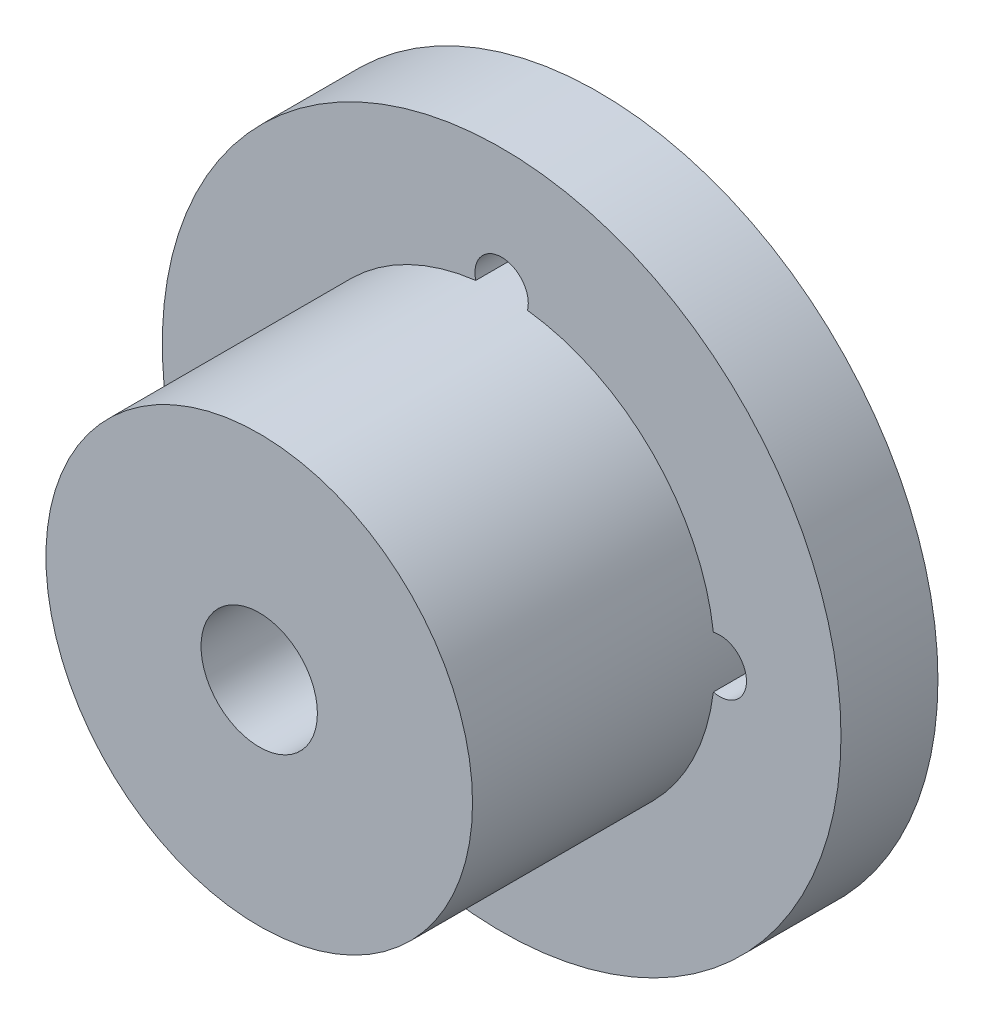
ISO-10303-21;
HEADER;
FILE_DESCRIPTION(('STEP AP214'),'2;1');
FILE_NAME('part.step','',(''),(''),'','','');
FILE_SCHEMA(('AUTOMOTIVE_DESIGN { 1 0 10303 214 1 1 1 1 }'));
ENDSEC;
DATA;
#1=APPLICATION_CONTEXT('core data for automotive mechanical design processes');
#2=APPLICATION_PROTOCOL_DEFINITION('international standard','automotive_design',2000,#1);
#3=PRODUCT_CONTEXT('',#1,'mechanical');
#4=PRODUCT('Part','Part','',(#3));
#5=PRODUCT_RELATED_PRODUCT_CATEGORY('part','',(#4));
#6=PRODUCT_DEFINITION_FORMATION('','',#4);
#7=PRODUCT_DEFINITION_CONTEXT('part definition',#1,'design');
#8=PRODUCT_DEFINITION('design','',#6,#7);
#9=PRODUCT_DEFINITION_SHAPE('','',#8);
#10=(LENGTH_UNIT() NAMED_UNIT(*) SI_UNIT(.MILLI.,.METRE.));
#11=(NAMED_UNIT(*) PLANE_ANGLE_UNIT() SI_UNIT($,.RADIAN.));
#12=(NAMED_UNIT(*) SI_UNIT($,.STERADIAN.) SOLID_ANGLE_UNIT());
#13=UNCERTAINTY_MEASURE_WITH_UNIT(LENGTH_MEASURE(1.E-05),#10,'distance_accuracy_value','');
#14=(GEOMETRIC_REPRESENTATION_CONTEXT(3) GLOBAL_UNCERTAINTY_ASSIGNED_CONTEXT((#13)) GLOBAL_UNIT_ASSIGNED_CONTEXT((#10,
#11,#12)) REPRESENTATION_CONTEXT('',''));
#15=CARTESIAN_POINT('',(0.,0.,0.));
#16=DIRECTION('',(0.,0.,1.));
#17=DIRECTION('',(1.,0.,0.));
#18=AXIS2_PLACEMENT_3D('',#15,#16,#17);
#19=CARTESIAN_POINT('',(0.,0.,10.));
#20=DIRECTION('',(0.,0.,1.));
#21=DIRECTION('',(1.,0.,0.));
#22=AXIS2_PLACEMENT_3D('',#19,#20,#21);
#23=PLANE('',#22);
#24=CARTESIAN_POINT('',(0.,0.,10.));
#25=DIRECTION('',(0.,0.,1.));
#26=DIRECTION('',(1.,0.,0.));
#27=AXIS2_PLACEMENT_3D('',#24,#25,#26);
#28=CIRCLE('',#27,35.);
#29=CARTESIAN_POINT('',(35.,0.,10.));
#30=VERTEX_POINT('',#29);
#31=EDGE_CURVE('E127',#30,#30,#28,.T.);
#32=ORIENTED_EDGE('',*,*,#31,.T.);
#33=EDGE_LOOP('',(#32));
#34=FACE_BOUND('',#33,.T.);
#35=CARTESIAN_POINT('',(22.5,0.,10.));
#36=DIRECTION('',(0.,0.,1.));
#37=DIRECTION('',(1.,0.,0.));
#38=AXIS2_PLACEMENT_3D('',#35,#36,#37);
#39=CIRCLE('',#38,2.75);
#40=CARTESIAN_POINT('',(21.8375,-2.6690061352496,10.));
#41=VERTEX_POINT('',#40);
#42=CARTESIAN_POINT('',(21.8375,2.6690061352496,10.));
#43=VERTEX_POINT('',#42);
#44=EDGE_CURVE('E112',#41,#43,#39,.T.);
#45=ORIENTED_EDGE('',*,*,#44,.F.);
#46=CARTESIAN_POINT('',(0.,0.,10.));
#47=DIRECTION('',(0.,0.,1.));
#48=DIRECTION('',(1.,0.,0.));
#49=AXIS2_PLACEMENT_3D('',#46,#47,#48);
#50=CIRCLE('',#49,22.);
#51=CARTESIAN_POINT('',(2.66900613524959,-21.8375,10.));
#52=VERTEX_POINT('',#51);
#53=EDGE_CURVE('E170',#41,#52,#50,.F.);
#54=ORIENTED_EDGE('',*,*,#53,.T.);
#55=CARTESIAN_POINT('',(0.,-22.5,10.));
#56=DIRECTION('',(0.,0.,1.));
#57=DIRECTION('',(1.,0.,0.));
#58=AXIS2_PLACEMENT_3D('',#55,#56,#57);
#59=CIRCLE('',#58,2.75);
#60=CARTESIAN_POINT('',(-2.66900613524959,-21.8375,10.));
#61=VERTEX_POINT('',#60);
#62=EDGE_CURVE('E140',#61,#52,#59,.T.);
#63=ORIENTED_EDGE('',*,*,#62,.F.);
#64=CARTESIAN_POINT('',(-21.8375,-2.6690061352496,10.));
#65=VERTEX_POINT('',#64);
#66=EDGE_CURVE('E48',#61,#65,#50,.F.);
#67=ORIENTED_EDGE('',*,*,#66,.T.);
#68=CARTESIAN_POINT('',(-22.5,0.,10.));
#69=DIRECTION('',(0.,0.,1.));
#70=DIRECTION('',(1.,0.,0.));
#71=AXIS2_PLACEMENT_3D('',#68,#69,#70);
#72=CIRCLE('',#71,2.75);
#73=CARTESIAN_POINT('',(-21.8375,2.6690061352496,10.));
#74=VERTEX_POINT('',#73);
#75=EDGE_CURVE('E149',#74,#65,#72,.T.);
#76=ORIENTED_EDGE('',*,*,#75,.F.);
#77=CARTESIAN_POINT('',(-2.6690061352496,21.8375,10.));
#78=VERTEX_POINT('',#77);
#79=EDGE_CURVE('E165',#74,#78,#50,.F.);
#80=ORIENTED_EDGE('',*,*,#79,.T.);
#81=CARTESIAN_POINT('',(0.,22.5,10.));
#82=DIRECTION('',(0.,0.,1.));
#83=DIRECTION('',(1.,0.,0.));
#84=AXIS2_PLACEMENT_3D('',#81,#82,#83);
#85=CIRCLE('',#84,2.75);
#86=CARTESIAN_POINT('',(2.6690061352496,21.8375,10.));
#87=VERTEX_POINT('',#86);
#88=EDGE_CURVE('E118',#87,#78,#85,.T.);
#89=ORIENTED_EDGE('',*,*,#88,.F.);
#90=EDGE_CURVE('E114',#87,#43,#50,.F.);
#91=ORIENTED_EDGE('',*,*,#90,.T.);
#92=EDGE_LOOP('',(#45,#54,#63,#67,#76,#80,#89,#91));
#93=FACE_BOUND('',#92,.T.);
#94=ADVANCED_FACE('F33',(#34,#93),#23,.T.);
#95=CARTESIAN_POINT('',(22.5,0.,10.));
#96=DIRECTION('',(0.,0.,-1.));
#97=DIRECTION('',(-1.,0.,0.));
#98=AXIS2_PLACEMENT_3D('',#95,#96,#97);
#99=CYLINDRICAL_SURFACE('',#98,2.75);
#100=ORIENTED_EDGE('',*,*,#44,.T.);
#101=DIRECTION('',(0.,0.,-1.));
#102=VECTOR('',#101,1.);
#103=CARTESIAN_POINT('',(21.8375,2.6690061352496,17.5));
#104=LINE('',#103,#102);
#105=CARTESIAN_POINT('',(21.8375,2.6690061352496,0.));
#106=VERTEX_POINT('',#105);
#107=EDGE_CURVE('E55',#43,#106,#104,.T.);
#108=ORIENTED_EDGE('',*,*,#107,.T.);
#109=CARTESIAN_POINT('',(22.5,0.,0.));
#110=DIRECTION('',(0.,0.,1.));
#111=DIRECTION('',(1.,0.,0.));
#112=AXIS2_PLACEMENT_3D('',#109,#110,#111);
#113=CIRCLE('',#112,2.75);
#114=CARTESIAN_POINT('',(21.8375,-2.6690061352496,0.));
#115=VERTEX_POINT('',#114);
#116=EDGE_CURVE('E110',#115,#106,#113,.T.);
#117=ORIENTED_EDGE('',*,*,#116,.F.);
#118=DIRECTION('',(0.,0.,-1.));
#119=VECTOR('',#118,1.);
#120=CARTESIAN_POINT('',(21.8375,-2.6690061352496,17.5));
#121=LINE('',#120,#119);
#122=EDGE_CURVE('E99',#115,#41,#121,.F.);
#123=ORIENTED_EDGE('',*,*,#122,.T.);
#124=EDGE_LOOP('',(#100,#108,#117,#123));
#125=FACE_BOUND('',#124,.T.);
#126=ADVANCED_FACE('F109',(#125),#99,.F.);
#127=CARTESIAN_POINT('',(0.,22.5,10.));
#128=DIRECTION('',(0.,0.,-1.));
#129=DIRECTION('',(-1.,0.,0.));
#130=AXIS2_PLACEMENT_3D('',#127,#128,#129);
#131=CYLINDRICAL_SURFACE('',#130,2.75);
#132=ORIENTED_EDGE('',*,*,#88,.T.);
#133=DIRECTION('',(0.,0.,-1.));
#134=VECTOR('',#133,1.);
#135=CARTESIAN_POINT('',(-2.6690061352496,21.8375,17.5));
#136=LINE('',#135,#134);
#137=CARTESIAN_POINT('',(-2.6690061352496,21.8375,0.));
#138=VERTEX_POINT('',#137);
#139=EDGE_CURVE('E163',#78,#138,#136,.T.);
#140=ORIENTED_EDGE('',*,*,#139,.T.);
#141=CARTESIAN_POINT('',(0.,22.5,0.));
#142=DIRECTION('',(0.,0.,1.));
#143=DIRECTION('',(1.,0.,0.));
#144=AXIS2_PLACEMENT_3D('',#141,#142,#143);
#145=CIRCLE('',#144,2.75);
#146=CARTESIAN_POINT('',(2.6690061352496,21.8375,0.));
#147=VERTEX_POINT('',#146);
#148=EDGE_CURVE('E123',#147,#138,#145,.T.);
#149=ORIENTED_EDGE('',*,*,#148,.F.);
#150=DIRECTION('',(0.,0.,-1.));
#151=VECTOR('',#150,1.);
#152=CARTESIAN_POINT('',(2.6690061352496,21.8375,17.5));
#153=LINE('',#152,#151);
#154=EDGE_CURVE('E161',#147,#87,#153,.F.);
#155=ORIENTED_EDGE('',*,*,#154,.T.);
#156=EDGE_LOOP('',(#132,#140,#149,#155));
#157=FACE_BOUND('',#156,.T.);
#158=ADVANCED_FACE('F160',(#157),#131,.F.);
#159=CARTESIAN_POINT('',(-22.5,0.,10.));
#160=DIRECTION('',(0.,0.,-1.));
#161=DIRECTION('',(-1.,0.,0.));
#162=AXIS2_PLACEMENT_3D('',#159,#160,#161);
#163=CYLINDRICAL_SURFACE('',#162,2.75);
#164=ORIENTED_EDGE('',*,*,#75,.T.);
#165=DIRECTION('',(0.,0.,-1.));
#166=VECTOR('',#165,1.);
#167=CARTESIAN_POINT('',(-21.8375,-2.6690061352496,17.5));
#168=LINE('',#167,#166);
#169=CARTESIAN_POINT('',(-21.8375,-2.6690061352496,0.));
#170=VERTEX_POINT('',#169);
#171=EDGE_CURVE('E175',#65,#170,#168,.T.);
#172=ORIENTED_EDGE('',*,*,#171,.T.);
#173=CARTESIAN_POINT('',(-22.5,0.,0.));
#174=DIRECTION('',(0.,0.,1.));
#175=DIRECTION('',(1.,0.,0.));
#176=AXIS2_PLACEMENT_3D('',#173,#174,#175);
#177=CIRCLE('',#176,2.75);
#178=CARTESIAN_POINT('',(-21.8375,2.6690061352496,0.));
#179=VERTEX_POINT('',#178);
#180=EDGE_CURVE('E146',#179,#170,#177,.T.);
#181=ORIENTED_EDGE('',*,*,#180,.F.);
#182=DIRECTION('',(0.,0.,-1.));
#183=VECTOR('',#182,1.);
#184=CARTESIAN_POINT('',(-21.8375,2.6690061352496,17.5));
#185=LINE('',#184,#183);
#186=EDGE_CURVE('E168',#179,#74,#185,.F.);
#187=ORIENTED_EDGE('',*,*,#186,.T.);
#188=EDGE_LOOP('',(#164,#172,#181,#187));
#189=FACE_BOUND('',#188,.T.);
#190=ADVANCED_FACE('F227',(#189),#163,.F.);
#191=CARTESIAN_POINT('',(0.,-22.5,10.));
#192=DIRECTION('',(0.,0.,-1.));
#193=DIRECTION('',(-1.,0.,0.));
#194=AXIS2_PLACEMENT_3D('',#191,#192,#193);
#195=CYLINDRICAL_SURFACE('',#194,2.75);
#196=ORIENTED_EDGE('',*,*,#62,.T.);
#197=DIRECTION('',(0.,0.,-1.));
#198=VECTOR('',#197,1.);
#199=CARTESIAN_POINT('',(2.66900613524959,-21.8375,17.5));
#200=LINE('',#199,#198);
#201=CARTESIAN_POINT('',(2.66900613524959,-21.8375,0.));
#202=VERTEX_POINT('',#201);
#203=EDGE_CURVE('E41',#52,#202,#200,.T.);
#204=ORIENTED_EDGE('',*,*,#203,.T.);
#205=CARTESIAN_POINT('',(0.,-22.5,0.));
#206=DIRECTION('',(0.,0.,1.));
#207=DIRECTION('',(1.,0.,0.));
#208=AXIS2_PLACEMENT_3D('',#205,#206,#207);
#209=CIRCLE('',#208,2.75);
#210=CARTESIAN_POINT('',(-2.66900613524959,-21.8375,0.));
#211=VERTEX_POINT('',#210);
#212=EDGE_CURVE('E113',#211,#202,#209,.T.);
#213=ORIENTED_EDGE('',*,*,#212,.F.);
#214=DIRECTION('',(0.,0.,-1.));
#215=VECTOR('',#214,1.);
#216=CARTESIAN_POINT('',(-2.66900613524959,-21.8375,17.5));
#217=LINE('',#216,#215);
#218=EDGE_CURVE('E130',#211,#61,#217,.F.);
#219=ORIENTED_EDGE('',*,*,#218,.T.);
#220=EDGE_LOOP('',(#196,#204,#213,#219));
#221=FACE_BOUND('',#220,.T.);
#222=ADVANCED_FACE('F138',(#221),#195,.F.);
#223=CARTESIAN_POINT('',(0.,0.,0.));
#224=DIRECTION('',(0.,0.,1.));
#225=DIRECTION('',(1.,0.,0.));
#226=AXIS2_PLACEMENT_3D('',#223,#224,#225);
#227=PLANE('',#226);
#228=ORIENTED_EDGE('',*,*,#212,.T.);
#229=CARTESIAN_POINT('',(0.,0.,0.));
#230=DIRECTION('',(0.,0.,1.));
#231=DIRECTION('',(1.,0.,0.));
#232=AXIS2_PLACEMENT_3D('',#229,#230,#231);
#233=CIRCLE('',#232,22.);
#234=EDGE_CURVE('E103',#211,#202,#233,.T.);
#235=ORIENTED_EDGE('',*,*,#234,.F.);
#236=EDGE_LOOP('',(#228,#235));
#237=FACE_BOUND('',#236,.T.);
#238=ORIENTED_EDGE('',*,*,#180,.T.);
#239=EDGE_CURVE('E313',#179,#170,#233,.T.);
#240=ORIENTED_EDGE('',*,*,#239,.F.);
#241=EDGE_LOOP('',(#238,#240));
#242=FACE_BOUND('',#241,.T.);
#243=ORIENTED_EDGE('',*,*,#148,.T.);
#244=EDGE_CURVE('E106',#147,#138,#233,.T.);
#245=ORIENTED_EDGE('',*,*,#244,.F.);
#246=EDGE_LOOP('',(#243,#245));
#247=FACE_BOUND('',#246,.T.);
#248=EDGE_CURVE('E95',#115,#106,#233,.T.);
#249=ORIENTED_EDGE('',*,*,#248,.F.);
#250=ORIENTED_EDGE('',*,*,#116,.T.);
#251=EDGE_LOOP('',(#249,#250));
#252=FACE_BOUND('',#251,.T.);
#253=CARTESIAN_POINT('',(0.,0.,0.));
#254=DIRECTION('',(0.,0.,1.));
#255=DIRECTION('',(1.,0.,0.));
#256=AXIS2_PLACEMENT_3D('',#253,#254,#255);
#257=CIRCLE('',#256,35.);
#258=CARTESIAN_POINT('',(35.,0.,0.));
#259=VERTEX_POINT('',#258);
#260=EDGE_CURVE('E120',#259,#259,#257,.T.);
#261=ORIENTED_EDGE('',*,*,#260,.F.);
#262=EDGE_LOOP('',(#261));
#263=FACE_BOUND('',#262,.T.);
#264=CARTESIAN_POINT('',(0.,0.,0.));
#265=DIRECTION('',(0.,0.,1.));
#266=DIRECTION('',(1.,0.,0.));
#267=AXIS2_PLACEMENT_3D('',#264,#265,#266);
#268=CIRCLE('',#267,4.);
#269=CARTESIAN_POINT('',(4.,0.,0.));
#270=VERTEX_POINT('',#269);
#271=EDGE_CURVE('E184',#270,#270,#268,.T.);
#272=ORIENTED_EDGE('',*,*,#271,.T.);
#273=EDGE_LOOP('',(#272));
#274=FACE_BOUND('',#273,.T.);
#275=ADVANCED_FACE('F116',(#237,#242,#247,#252,#263,#274),#227,.F.);
#276=CARTESIAN_POINT('',(0.,0.,10.));
#277=DIRECTION('',(0.,0.,-1.));
#278=DIRECTION('',(-1.,0.,0.));
#279=AXIS2_PLACEMENT_3D('',#276,#277,#278);
#280=CYLINDRICAL_SURFACE('',#279,35.);
#281=ORIENTED_EDGE('',*,*,#31,.F.);
#282=EDGE_LOOP('',(#281));
#283=FACE_BOUND('',#282,.T.);
#284=ORIENTED_EDGE('',*,*,#260,.T.);
#285=EDGE_LOOP('',(#284));
#286=FACE_BOUND('',#285,.T.);
#287=ADVANCED_FACE('F35',(#283,#286),#280,.T.);
#288=CARTESIAN_POINT('',(0.,0.,10.));
#289=DIRECTION('',(0.,0.,-1.));
#290=DIRECTION('',(-1.,0.,0.));
#291=AXIS2_PLACEMENT_3D('',#288,#289,#290);
#292=CYLINDRICAL_SURFACE('',#291,6.);
#293=CARTESIAN_POINT('',(0.,0.,20.));
#294=DIRECTION('',(0.,0.,1.));
#295=DIRECTION('',(1.,0.,0.));
#296=AXIS2_PLACEMENT_3D('',#293,#294,#295);
#297=CIRCLE('',#296,6.);
#298=CARTESIAN_POINT('',(6.,0.,20.));
#299=VERTEX_POINT('',#298);
#300=EDGE_CURVE('E11',#299,#299,#297,.T.);
#301=ORIENTED_EDGE('',*,*,#300,.F.);
#302=EDGE_LOOP('',(#301));
#303=FACE_BOUND('',#302,.T.);
#304=CARTESIAN_POINT('',(0.,0.,35.));
#305=DIRECTION('',(0.,0.,1.));
#306=DIRECTION('',(1.,0.,0.));
#307=AXIS2_PLACEMENT_3D('',#304,#305,#306);
#308=CIRCLE('',#307,6.);
#309=CARTESIAN_POINT('',(6.,0.,35.));
#310=VERTEX_POINT('',#309);
#311=EDGE_CURVE('E104',#310,#310,#308,.T.);
#312=ORIENTED_EDGE('',*,*,#311,.T.);
#313=EDGE_LOOP('',(#312));
#314=FACE_BOUND('',#313,.T.);
#315=ADVANCED_FACE('F199',(#303,#314),#292,.F.);
#316=CARTESIAN_POINT('',(0.,0.,35.));
#317=DIRECTION('',(0.,0.,1.));
#318=DIRECTION('',(1.,0.,0.));
#319=AXIS2_PLACEMENT_3D('',#316,#317,#318);
#320=PLANE('',#319);
#321=CARTESIAN_POINT('',(0.,0.,35.));
#322=DIRECTION('',(0.,0.,1.));
#323=DIRECTION('',(1.,0.,0.));
#324=AXIS2_PLACEMENT_3D('',#321,#322,#323);
#325=CIRCLE('',#324,22.);
#326=CARTESIAN_POINT('',(22.,0.,35.));
#327=VERTEX_POINT('',#326);
#328=EDGE_CURVE('E177',#327,#327,#325,.T.);
#329=ORIENTED_EDGE('',*,*,#328,.T.);
#330=EDGE_LOOP('',(#329));
#331=FACE_BOUND('',#330,.T.);
#332=ORIENTED_EDGE('',*,*,#311,.F.);
#333=EDGE_LOOP('',(#332));
#334=FACE_BOUND('',#333,.T.);
#335=ADVANCED_FACE('F202',(#331,#334),#320,.T.);
#336=CARTESIAN_POINT('',(0.,0.,35.));
#337=DIRECTION('',(0.,0.,-1.));
#338=DIRECTION('',(-1.,0.,0.));
#339=AXIS2_PLACEMENT_3D('',#336,#337,#338);
#340=CYLINDRICAL_SURFACE('',#339,22.);
#341=ORIENTED_EDGE('',*,*,#107,.F.);
#342=ORIENTED_EDGE('',*,*,#90,.F.);
#343=ORIENTED_EDGE('',*,*,#154,.F.);
#344=ORIENTED_EDGE('',*,*,#244,.T.);
#345=ORIENTED_EDGE('',*,*,#139,.F.);
#346=ORIENTED_EDGE('',*,*,#79,.F.);
#347=ORIENTED_EDGE('',*,*,#186,.F.);
#348=ORIENTED_EDGE('',*,*,#239,.T.);
#349=ORIENTED_EDGE('',*,*,#171,.F.);
#350=ORIENTED_EDGE('',*,*,#66,.F.);
#351=ORIENTED_EDGE('',*,*,#218,.F.);
#352=ORIENTED_EDGE('',*,*,#234,.T.);
#353=ORIENTED_EDGE('',*,*,#203,.F.);
#354=ORIENTED_EDGE('',*,*,#53,.F.);
#355=ORIENTED_EDGE('',*,*,#122,.F.);
#356=ORIENTED_EDGE('',*,*,#248,.T.);
#357=EDGE_LOOP('',(#341,#342,#343,#344,#345,#346,#347,#348,#349,#350,#351,#352,#353,#354,#355,#356));
#358=FACE_BOUND('',#357,.T.);
#359=ORIENTED_EDGE('',*,*,#328,.F.);
#360=EDGE_LOOP('',(#359));
#361=FACE_BOUND('',#360,.T.);
#362=ADVANCED_FACE('F96',(#358,#361),#340,.T.);
#363=CARTESIAN_POINT('',(0.,0.,20.));
#364=DIRECTION('',(0.,0.,1.));
#365=DIRECTION('',(1.,0.,0.));
#366=AXIS2_PLACEMENT_3D('',#363,#364,#365);
#367=PLANE('',#366);
#368=CARTESIAN_POINT('',(0.,0.,20.));
#369=DIRECTION('',(0.,0.,1.));
#370=DIRECTION('',(1.,0.,0.));
#371=AXIS2_PLACEMENT_3D('',#368,#369,#370);
#372=CIRCLE('',#371,4.);
#373=CARTESIAN_POINT('',(4.,0.,20.));
#374=VERTEX_POINT('',#373);
#375=EDGE_CURVE('E183',#374,#374,#372,.T.);
#376=ORIENTED_EDGE('',*,*,#375,.F.);
#377=EDGE_LOOP('',(#376));
#378=FACE_BOUND('',#377,.T.);
#379=ORIENTED_EDGE('',*,*,#300,.T.);
#380=EDGE_LOOP('',(#379));
#381=FACE_BOUND('',#380,.T.);
#382=ADVANCED_FACE('F193',(#378,#381),#367,.T.);
#383=CARTESIAN_POINT('',(0.,0.,20.));
#384=DIRECTION('',(0.,0.,-1.));
#385=DIRECTION('',(-1.,0.,0.));
#386=AXIS2_PLACEMENT_3D('',#383,#384,#385);
#387=CYLINDRICAL_SURFACE('',#386,4.);
#388=ORIENTED_EDGE('',*,*,#375,.T.);
#389=EDGE_LOOP('',(#388));
#390=FACE_BOUND('',#389,.T.);
#391=ORIENTED_EDGE('',*,*,#271,.F.);
#392=EDGE_LOOP('',(#391));
#393=FACE_BOUND('',#392,.T.);
#394=ADVANCED_FACE('F190',(#390,#393),#387,.F.);
#395=CLOSED_SHELL('',(#94,#126,#158,#190,#222,#275,#287,#315,#335,#362,#382,#394));
#396=MANIFOLD_SOLID_BREP('B2',#395);
#397=ADVANCED_BREP_SHAPE_REPRESENTATION('',(#18,#396),#14);
#398=SHAPE_DEFINITION_REPRESENTATION(#9,#397);
ENDSEC;
END-ISO-10303-21;
